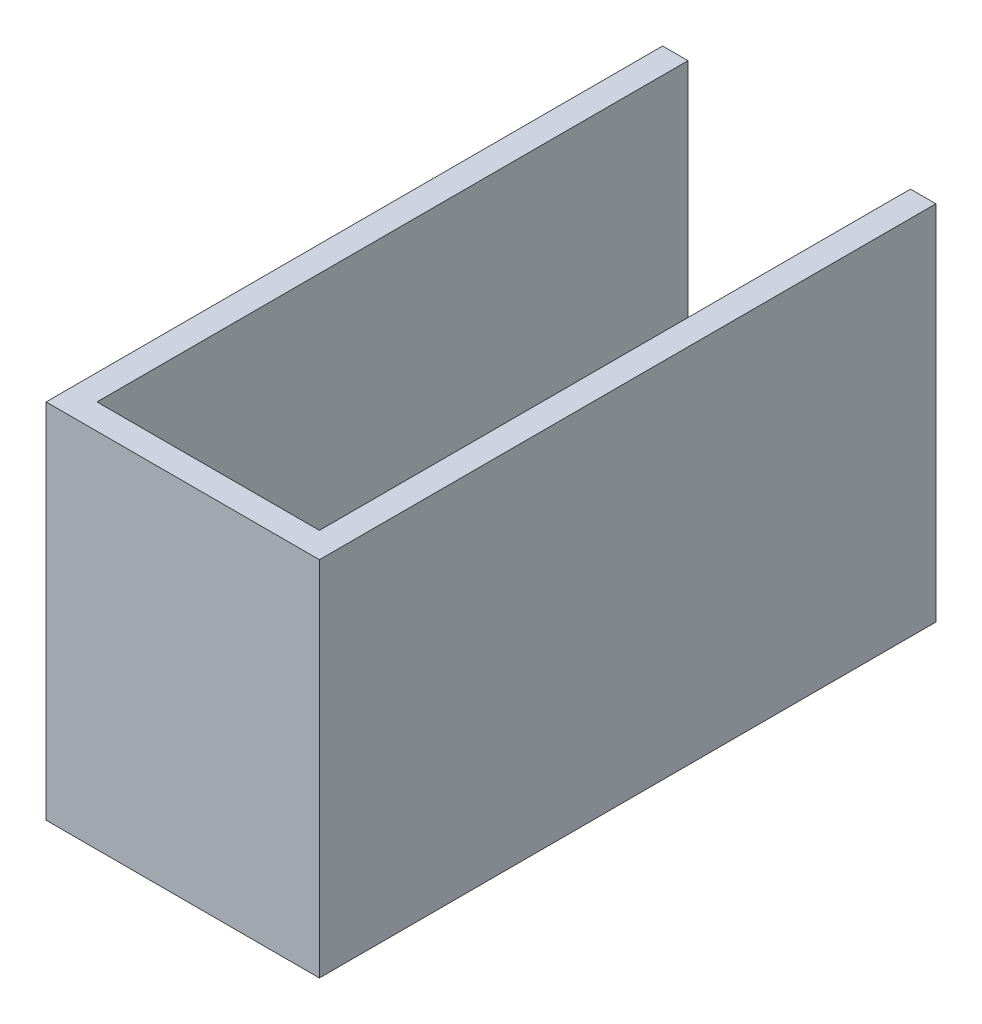
ISO-10303-21;
HEADER;
FILE_DESCRIPTION(('STEP AP214'),'2;1');
FILE_NAME('part.step','',(''),(''),'','','');
FILE_SCHEMA(('AUTOMOTIVE_DESIGN { 1 0 10303 214 1 1 1 1 }'));
ENDSEC;
DATA;
#1=APPLICATION_CONTEXT('core data for automotive mechanical design processes');
#2=APPLICATION_PROTOCOL_DEFINITION('international standard','automotive_design',2000,#1);
#3=PRODUCT_CONTEXT('',#1,'mechanical');
#4=PRODUCT('Part','Part','',(#3));
#5=PRODUCT_RELATED_PRODUCT_CATEGORY('part','',(#4));
#6=PRODUCT_DEFINITION_FORMATION('','',#4);
#7=PRODUCT_DEFINITION_CONTEXT('part definition',#1,'design');
#8=PRODUCT_DEFINITION('design','',#6,#7);
#9=PRODUCT_DEFINITION_SHAPE('','',#8);
#10=(LENGTH_UNIT() NAMED_UNIT(*) SI_UNIT(.MILLI.,.METRE.));
#11=(NAMED_UNIT(*) PLANE_ANGLE_UNIT() SI_UNIT($,.RADIAN.));
#12=(NAMED_UNIT(*) SI_UNIT($,.STERADIAN.) SOLID_ANGLE_UNIT());
#13=UNCERTAINTY_MEASURE_WITH_UNIT(LENGTH_MEASURE(1.E-05),#10,'distance_accuracy_value','');
#14=(GEOMETRIC_REPRESENTATION_CONTEXT(3) GLOBAL_UNCERTAINTY_ASSIGNED_CONTEXT((#13)) GLOBAL_UNIT_ASSIGNED_CONTEXT((#10,
#11,#12)) REPRESENTATION_CONTEXT('',''));
#15=CARTESIAN_POINT('',(0.,0.,0.));
#16=DIRECTION('',(0.,0.,1.));
#17=DIRECTION('',(1.,0.,0.));
#18=AXIS2_PLACEMENT_3D('',#15,#16,#17);
#19=CARTESIAN_POINT('',(0.,0.,48.5));
#20=DIRECTION('',(1.,0.,0.));
#21=DIRECTION('',(0.,0.,-1.));
#22=AXIS2_PLACEMENT_3D('',#19,#20,#21);
#23=PLANE('',#22);
#24=DIRECTION('',(0.,-1.,0.));
#25=VECTOR('',#24,1.);
#26=CARTESIAN_POINT('',(0.,0.,0.));
#27=LINE('',#26,#25);
#28=CARTESIAN_POINT('',(0.,28.5,0.));
#29=VERTEX_POINT('',#28);
#30=CARTESIAN_POINT('',(0.,0.,0.));
#31=VERTEX_POINT('',#30);
#32=EDGE_CURVE('E134',#29,#31,#27,.T.);
#33=ORIENTED_EDGE('',*,*,#32,.T.);
#34=DIRECTION('',(0.,0.,-1.));
#35=VECTOR('',#34,1.);
#36=CARTESIAN_POINT('',(0.,0.,48.5));
#37=LINE('',#36,#35);
#38=CARTESIAN_POINT('',(0.,0.,48.5));
#39=VERTEX_POINT('',#38);
#40=EDGE_CURVE('E161',#39,#31,#37,.T.);
#41=ORIENTED_EDGE('',*,*,#40,.F.);
#42=DIRECTION('',(0.,-1.,0.));
#43=VECTOR('',#42,1.);
#44=CARTESIAN_POINT('',(0.,0.,48.5));
#45=LINE('',#44,#43);
#46=CARTESIAN_POINT('',(0.,28.5,48.5));
#47=VERTEX_POINT('',#46);
#48=EDGE_CURVE('E141',#47,#39,#45,.T.);
#49=ORIENTED_EDGE('',*,*,#48,.F.);
#50=DIRECTION('',(0.,0.,-1.));
#51=VECTOR('',#50,1.);
#52=CARTESIAN_POINT('',(0.,28.5,48.5));
#53=LINE('',#52,#51);
#54=EDGE_CURVE('E150',#47,#29,#53,.T.);
#55=ORIENTED_EDGE('',*,*,#54,.T.);
#56=EDGE_LOOP('',(#33,#41,#49,#55));
#57=FACE_BOUND('',#56,.T.);
#58=ADVANCED_FACE('F40',(#57),#23,.F.);
#59=CARTESIAN_POINT('',(0.,0.,48.5));
#60=DIRECTION('',(0.,1.,0.));
#61=DIRECTION('',(0.,0.,1.));
#62=AXIS2_PLACEMENT_3D('',#59,#60,#61);
#63=PLANE('',#62);
#64=CARTESIAN_POINT('',(10.7500000000001,0.,9.25));
#65=DIRECTION('',(0.,1.,0.));
#66=DIRECTION('',(0.,0.,1.));
#67=AXIS2_PLACEMENT_3D('',#64,#65,#66);
#68=CIRCLE('',#67,1.45);
#69=CARTESIAN_POINT('',(10.7500000000001,0.,10.7));
#70=VERTEX_POINT('',#69);
#71=EDGE_CURVE('E12',#70,#70,#68,.F.);
#72=ORIENTED_EDGE('',*,*,#71,.F.);
#73=EDGE_LOOP('',(#72));
#74=FACE_BOUND('',#73,.T.);
#75=CARTESIAN_POINT('',(10.7499999999999,0.,39.25));
#76=DIRECTION('',(0.,1.,0.));
#77=DIRECTION('',(0.,0.,1.));
#78=AXIS2_PLACEMENT_3D('',#75,#76,#77);
#79=CIRCLE('',#78,1.45);
#80=CARTESIAN_POINT('',(10.7499999999999,0.,40.7));
#81=VERTEX_POINT('',#80);
#82=EDGE_CURVE('E48',#81,#81,#79,.F.);
#83=ORIENTED_EDGE('',*,*,#82,.F.);
#84=EDGE_LOOP('',(#83));
#85=FACE_BOUND('',#84,.T.);
#86=DIRECTION('',(1.,0.,0.));
#87=VECTOR('',#86,1.);
#88=CARTESIAN_POINT('',(0.,0.,0.));
#89=LINE('',#88,#87);
#90=CARTESIAN_POINT('',(21.5,0.,0.));
#91=VERTEX_POINT('',#90);
#92=EDGE_CURVE('E143',#31,#91,#89,.T.);
#93=ORIENTED_EDGE('',*,*,#92,.T.);
#94=DIRECTION('',(0.,0.,-1.));
#95=VECTOR('',#94,1.);
#96=CARTESIAN_POINT('',(21.5,0.,48.5));
#97=LINE('',#96,#95);
#98=CARTESIAN_POINT('',(21.5,0.,48.5));
#99=VERTEX_POINT('',#98);
#100=EDGE_CURVE('E158',#99,#91,#97,.T.);
#101=ORIENTED_EDGE('',*,*,#100,.F.);
#102=DIRECTION('',(1.,0.,0.));
#103=VECTOR('',#102,1.);
#104=CARTESIAN_POINT('',(0.,0.,48.5));
#105=LINE('',#104,#103);
#106=EDGE_CURVE('E93',#39,#99,#105,.T.);
#107=ORIENTED_EDGE('',*,*,#106,.F.);
#108=ORIENTED_EDGE('',*,*,#40,.T.);
#109=EDGE_LOOP('',(#93,#101,#107,#108));
#110=FACE_BOUND('',#109,.T.);
#111=ADVANCED_FACE('F170',(#74,#85,#110),#63,.F.);
#112=CARTESIAN_POINT('',(21.5,0.,48.5));
#113=DIRECTION('',(-1.,0.,0.));
#114=DIRECTION('',(0.,0.,1.));
#115=AXIS2_PLACEMENT_3D('',#112,#113,#114);
#116=PLANE('',#115);
#117=DIRECTION('',(0.,1.,0.));
#118=VECTOR('',#117,1.);
#119=CARTESIAN_POINT('',(21.5,0.,0.));
#120=LINE('',#119,#118);
#121=CARTESIAN_POINT('',(21.5,28.5,0.));
#122=VERTEX_POINT('',#121);
#123=EDGE_CURVE('E137',#91,#122,#120,.T.);
#124=ORIENTED_EDGE('',*,*,#123,.T.);
#125=DIRECTION('',(0.,0.,-1.));
#126=VECTOR('',#125,1.);
#127=CARTESIAN_POINT('',(21.5,28.5,48.5));
#128=LINE('',#127,#126);
#129=CARTESIAN_POINT('',(21.5,28.5,48.5));
#130=VERTEX_POINT('',#129);
#131=EDGE_CURVE('E154',#130,#122,#128,.T.);
#132=ORIENTED_EDGE('',*,*,#131,.F.);
#133=DIRECTION('',(0.,1.,0.));
#134=VECTOR('',#133,1.);
#135=CARTESIAN_POINT('',(21.5,0.,48.5));
#136=LINE('',#135,#134);
#137=EDGE_CURVE('E179',#99,#130,#136,.T.);
#138=ORIENTED_EDGE('',*,*,#137,.F.);
#139=ORIENTED_EDGE('',*,*,#100,.T.);
#140=EDGE_LOOP('',(#124,#132,#138,#139));
#141=FACE_BOUND('',#140,.T.);
#142=ADVANCED_FACE('F172',(#141),#116,.F.);
#143=CARTESIAN_POINT('',(0.,28.5,48.5));
#144=DIRECTION('',(0.,-1.,0.));
#145=DIRECTION('',(0.,0.,-1.));
#146=AXIS2_PLACEMENT_3D('',#143,#144,#145);
#147=PLANE('',#146);
#148=DIRECTION('',(-1.,0.,0.));
#149=VECTOR('',#148,1.);
#150=CARTESIAN_POINT('',(0.,28.5,0.));
#151=LINE('',#150,#149);
#152=CARTESIAN_POINT('',(19.5,28.5,0.));
#153=VERTEX_POINT('',#152);
#154=EDGE_CURVE('E136',#122,#153,#151,.T.);
#155=ORIENTED_EDGE('',*,*,#154,.T.);
#156=DIRECTION('',(0.,0.,1.));
#157=VECTOR('',#156,1.);
#158=CARTESIAN_POINT('',(19.5,28.5,0.));
#159=LINE('',#158,#157);
#160=CARTESIAN_POINT('',(19.5,28.5,46.5));
#161=VERTEX_POINT('',#160);
#162=EDGE_CURVE('E182',#153,#161,#159,.T.);
#163=ORIENTED_EDGE('',*,*,#162,.T.);
#164=DIRECTION('',(-1.,0.,0.));
#165=VECTOR('',#164,1.);
#166=CARTESIAN_POINT('',(19.5,28.5,46.5));
#167=LINE('',#166,#165);
#168=CARTESIAN_POINT('',(2.,28.5,46.5));
#169=VERTEX_POINT('',#168);
#170=EDGE_CURVE('E120',#161,#169,#167,.T.);
#171=ORIENTED_EDGE('',*,*,#170,.T.);
#172=DIRECTION('',(0.,0.,1.));
#173=VECTOR('',#172,1.);
#174=CARTESIAN_POINT('',(2.,28.5,0.));
#175=LINE('',#174,#173);
#176=CARTESIAN_POINT('',(2.,28.5,0.));
#177=VERTEX_POINT('',#176);
#178=EDGE_CURVE('E115',#177,#169,#175,.T.);
#179=ORIENTED_EDGE('',*,*,#178,.F.);
#180=EDGE_CURVE('E85',#177,#29,#151,.T.);
#181=ORIENTED_EDGE('',*,*,#180,.T.);
#182=ORIENTED_EDGE('',*,*,#54,.F.);
#183=DIRECTION('',(-1.,0.,0.));
#184=VECTOR('',#183,1.);
#185=CARTESIAN_POINT('',(0.,28.5,48.5));
#186=LINE('',#185,#184);
#187=EDGE_CURVE('E64',#130,#47,#186,.T.);
#188=ORIENTED_EDGE('',*,*,#187,.F.);
#189=ORIENTED_EDGE('',*,*,#131,.T.);
#190=EDGE_LOOP('',(#155,#163,#171,#179,#181,#182,#188,#189));
#191=FACE_BOUND('',#190,.T.);
#192=ADVANCED_FACE('F124',(#191),#147,.F.);
#193=CARTESIAN_POINT('',(0.,0.,48.5));
#194=DIRECTION('',(0.,0.,-1.));
#195=DIRECTION('',(-1.,0.,0.));
#196=AXIS2_PLACEMENT_3D('',#193,#194,#195);
#197=PLANE('',#196);
#198=ORIENTED_EDGE('',*,*,#48,.T.);
#199=ORIENTED_EDGE('',*,*,#106,.T.);
#200=ORIENTED_EDGE('',*,*,#137,.T.);
#201=ORIENTED_EDGE('',*,*,#187,.T.);
#202=EDGE_LOOP('',(#198,#199,#200,#201));
#203=FACE_BOUND('',#202,.T.);
#204=ADVANCED_FACE('F227',(#203),#197,.F.);
#205=CARTESIAN_POINT('',(0.,0.,0.));
#206=DIRECTION('',(0.,0.,-1.));
#207=DIRECTION('',(-1.,0.,0.));
#208=AXIS2_PLACEMENT_3D('',#205,#206,#207);
#209=PLANE('',#208);
#210=DIRECTION('',(0.,1.,0.));
#211=VECTOR('',#210,1.);
#212=CARTESIAN_POINT('',(19.5,2.,0.));
#213=LINE('',#212,#211);
#214=CARTESIAN_POINT('',(19.5,2.,0.));
#215=VERTEX_POINT('',#214);
#216=EDGE_CURVE('E181',#215,#153,#213,.T.);
#217=ORIENTED_EDGE('',*,*,#216,.T.);
#218=ORIENTED_EDGE('',*,*,#154,.F.);
#219=ORIENTED_EDGE('',*,*,#123,.F.);
#220=ORIENTED_EDGE('',*,*,#92,.F.);
#221=ORIENTED_EDGE('',*,*,#32,.F.);
#222=ORIENTED_EDGE('',*,*,#180,.F.);
#223=DIRECTION('',(0.,-1.,0.));
#224=VECTOR('',#223,1.);
#225=CARTESIAN_POINT('',(2.,2.,0.));
#226=LINE('',#225,#224);
#227=CARTESIAN_POINT('',(2.,2.,0.));
#228=VERTEX_POINT('',#227);
#229=EDGE_CURVE('E113',#177,#228,#226,.T.);
#230=ORIENTED_EDGE('',*,*,#229,.T.);
#231=DIRECTION('',(1.,0.,0.));
#232=VECTOR('',#231,1.);
#233=CARTESIAN_POINT('',(19.5,2.,0.));
#234=LINE('',#233,#232);
#235=EDGE_CURVE('E202',#228,#215,#234,.T.);
#236=ORIENTED_EDGE('',*,*,#235,.T.);
#237=EDGE_LOOP('',(#217,#218,#219,#220,#221,#222,#230,#236));
#238=FACE_BOUND('',#237,.T.);
#239=ADVANCED_FACE('F132',(#238),#209,.T.);
#240=CARTESIAN_POINT('',(0.,0.,46.5));
#241=DIRECTION('',(0.,0.,-1.));
#242=DIRECTION('',(-1.,0.,0.));
#243=AXIS2_PLACEMENT_3D('',#240,#241,#242);
#244=PLANE('',#243);
#245=ORIENTED_EDGE('',*,*,#170,.F.);
#246=DIRECTION('',(0.,1.,0.));
#247=VECTOR('',#246,1.);
#248=CARTESIAN_POINT('',(19.5,2.,46.5));
#249=LINE('',#248,#247);
#250=CARTESIAN_POINT('',(19.5,2.,46.5));
#251=VERTEX_POINT('',#250);
#252=EDGE_CURVE('E222',#251,#161,#249,.T.);
#253=ORIENTED_EDGE('',*,*,#252,.F.);
#254=DIRECTION('',(1.,0.,0.));
#255=VECTOR('',#254,1.);
#256=CARTESIAN_POINT('',(19.5,2.,46.5));
#257=LINE('',#256,#255);
#258=CARTESIAN_POINT('',(2.,2.,46.5));
#259=VERTEX_POINT('',#258);
#260=EDGE_CURVE('E207',#259,#251,#257,.T.);
#261=ORIENTED_EDGE('',*,*,#260,.F.);
#262=DIRECTION('',(0.,-1.,0.));
#263=VECTOR('',#262,1.);
#264=CARTESIAN_POINT('',(2.,2.,46.5));
#265=LINE('',#264,#263);
#266=EDGE_CURVE('E128',#169,#259,#265,.T.);
#267=ORIENTED_EDGE('',*,*,#266,.F.);
#268=EDGE_LOOP('',(#245,#253,#261,#267));
#269=FACE_BOUND('',#268,.T.);
#270=ADVANCED_FACE('F261',(#269),#244,.T.);
#271=CARTESIAN_POINT('',(19.5,2.,0.));
#272=DIRECTION('',(1.,0.,0.));
#273=DIRECTION('',(0.,0.,-1.));
#274=AXIS2_PLACEMENT_3D('',#271,#272,#273);
#275=PLANE('',#274);
#276=ORIENTED_EDGE('',*,*,#252,.T.);
#277=ORIENTED_EDGE('',*,*,#162,.F.);
#278=ORIENTED_EDGE('',*,*,#216,.F.);
#279=DIRECTION('',(0.,0.,1.));
#280=VECTOR('',#279,1.);
#281=CARTESIAN_POINT('',(19.5,2.,0.));
#282=LINE('',#281,#280);
#283=EDGE_CURVE('E218',#215,#251,#282,.T.);
#284=ORIENTED_EDGE('',*,*,#283,.T.);
#285=EDGE_LOOP('',(#276,#277,#278,#284));
#286=FACE_BOUND('',#285,.T.);
#287=ADVANCED_FACE('F268',(#286),#275,.F.);
#288=CARTESIAN_POINT('',(19.5,2.,0.));
#289=DIRECTION('',(0.,-1.,0.));
#290=DIRECTION('',(1.,0.,0.));
#291=AXIS2_PLACEMENT_3D('',#288,#289,#290);
#292=PLANE('',#291);
#293=ORIENTED_EDGE('',*,*,#260,.T.);
#294=ORIENTED_EDGE('',*,*,#283,.F.);
#295=ORIENTED_EDGE('',*,*,#235,.F.);
#296=DIRECTION('',(0.,0.,1.));
#297=VECTOR('',#296,1.);
#298=CARTESIAN_POINT('',(2.,2.,0.));
#299=LINE('',#298,#297);
#300=EDGE_CURVE('E55',#228,#259,#299,.T.);
#301=ORIENTED_EDGE('',*,*,#300,.T.);
#302=EDGE_LOOP('',(#293,#294,#295,#301));
#303=FACE_BOUND('',#302,.T.);
#304=ADVANCED_FACE('F276',(#303),#292,.F.);
#305=CARTESIAN_POINT('',(2.,2.,0.));
#306=DIRECTION('',(-1.,0.,0.));
#307=DIRECTION('',(0.,-1.,0.));
#308=AXIS2_PLACEMENT_3D('',#305,#306,#307);
#309=PLANE('',#308);
#310=ORIENTED_EDGE('',*,*,#266,.T.);
#311=ORIENTED_EDGE('',*,*,#300,.F.);
#312=ORIENTED_EDGE('',*,*,#229,.F.);
#313=ORIENTED_EDGE('',*,*,#178,.T.);
#314=EDGE_LOOP('',(#310,#311,#312,#313));
#315=FACE_BOUND('',#314,.T.);
#316=ADVANCED_FACE('F114',(#315),#309,.F.);
#317=CARTESIAN_POINT('',(10.7499999999999,-5.,39.25));
#318=DIRECTION('',(0.,1.,0.));
#319=DIRECTION('',(0.,0.,1.));
#320=AXIS2_PLACEMENT_3D('',#317,#318,#319);
#321=CYLINDRICAL_SURFACE('',#320,1.45);
#322=CARTESIAN_POINT('',(10.7499999999999,-5.,39.25));
#323=DIRECTION('',(0.,-1.,0.));
#324=DIRECTION('',(0.,0.,-1.));
#325=AXIS2_PLACEMENT_3D('',#322,#323,#324);
#326=CIRCLE('',#325,1.45);
#327=CARTESIAN_POINT('',(10.7499999999999,-5.,37.8));
#328=VERTEX_POINT('',#327);
#329=EDGE_CURVE('E354',#328,#328,#326,.T.);
#330=ORIENTED_EDGE('',*,*,#329,.F.);
#331=EDGE_LOOP('',(#330));
#332=FACE_BOUND('',#331,.T.);
#333=ORIENTED_EDGE('',*,*,#82,.T.);
#334=EDGE_LOOP('',(#333));
#335=FACE_BOUND('',#334,.T.);
#336=ADVANCED_FACE('F168',(#332,#335),#321,.T.);
#337=CARTESIAN_POINT('',(10.7499999999999,-5.,39.25));
#338=DIRECTION('',(0.,-1.,0.));
#339=DIRECTION('',(0.,0.,-1.));
#340=AXIS2_PLACEMENT_3D('',#337,#338,#339);
#341=PLANE('',#340);
#342=ORIENTED_EDGE('',*,*,#329,.T.);
#343=EDGE_LOOP('',(#342));
#344=FACE_BOUND('',#343,.T.);
#345=ADVANCED_FACE('F295',(#344),#341,.T.);
#346=CARTESIAN_POINT('',(10.7500000000001,-5.,9.25));
#347=DIRECTION('',(0.,1.,0.));
#348=DIRECTION('',(0.,0.,1.));
#349=AXIS2_PLACEMENT_3D('',#346,#347,#348);
#350=CYLINDRICAL_SURFACE('',#349,1.45);
#351=CARTESIAN_POINT('',(10.7500000000001,-5.,9.25));
#352=DIRECTION('',(0.,-1.,0.));
#353=DIRECTION('',(0.,0.,-1.));
#354=AXIS2_PLACEMENT_3D('',#351,#352,#353);
#355=CIRCLE('',#354,1.45);
#356=CARTESIAN_POINT('',(10.7500000000001,-5.,7.8));
#357=VERTEX_POINT('',#356);
#358=EDGE_CURVE('E352',#357,#357,#355,.T.);
#359=ORIENTED_EDGE('',*,*,#358,.F.);
#360=EDGE_LOOP('',(#359));
#361=FACE_BOUND('',#360,.T.);
#362=ORIENTED_EDGE('',*,*,#71,.T.);
#363=EDGE_LOOP('',(#362));
#364=FACE_BOUND('',#363,.T.);
#365=ADVANCED_FACE('F303',(#361,#364),#350,.T.);
#366=CARTESIAN_POINT('',(10.7500000000001,-5.,9.25));
#367=DIRECTION('',(0.,-1.,0.));
#368=DIRECTION('',(0.,0.,-1.));
#369=AXIS2_PLACEMENT_3D('',#366,#367,#368);
#370=PLANE('',#369);
#371=ORIENTED_EDGE('',*,*,#358,.T.);
#372=EDGE_LOOP('',(#371));
#373=FACE_BOUND('',#372,.T.);
#374=ADVANCED_FACE('F311',(#373),#370,.T.);
#375=CLOSED_SHELL('',(#58,#111,#142,#192,#204,#239,#270,#287,#304,#316,#336,#345,#365,#374));
#376=MANIFOLD_SOLID_BREP('B2',#375);
#377=ADVANCED_BREP_SHAPE_REPRESENTATION('',(#18,#376),#14);
#378=SHAPE_DEFINITION_REPRESENTATION(#9,#377);
ENDSEC;
END-ISO-10303-21;
